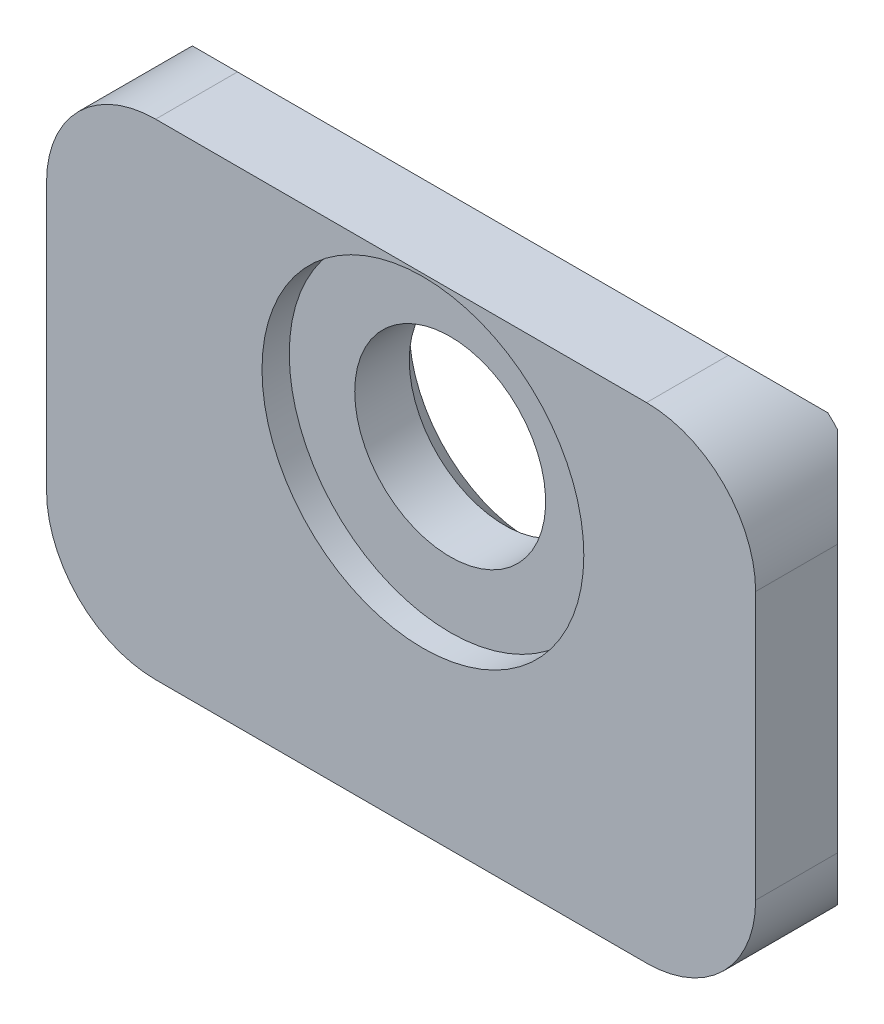
ISO-10303-21;
HEADER;
FILE_DESCRIPTION(('STEP AP214'),'2;1');
FILE_NAME('part.step','',(''),(''),'','','');
FILE_SCHEMA(('AUTOMOTIVE_DESIGN { 1 0 10303 214 1 1 1 1 }'));
ENDSEC;
DATA;
#1=APPLICATION_CONTEXT('core data for automotive mechanical design processes');
#2=APPLICATION_PROTOCOL_DEFINITION('international standard','automotive_design',2000,#1);
#3=PRODUCT_CONTEXT('',#1,'mechanical');
#4=PRODUCT('Part','Part','',(#3));
#5=PRODUCT_RELATED_PRODUCT_CATEGORY('part','',(#4));
#6=PRODUCT_DEFINITION_FORMATION('','',#4);
#7=PRODUCT_DEFINITION_CONTEXT('part definition',#1,'design');
#8=PRODUCT_DEFINITION('design','',#6,#7);
#9=PRODUCT_DEFINITION_SHAPE('','',#8);
#10=(LENGTH_UNIT() NAMED_UNIT(*) SI_UNIT(.MILLI.,.METRE.));
#11=(NAMED_UNIT(*) PLANE_ANGLE_UNIT() SI_UNIT($,.RADIAN.));
#12=(NAMED_UNIT(*) SI_UNIT($,.STERADIAN.) SOLID_ANGLE_UNIT());
#13=UNCERTAINTY_MEASURE_WITH_UNIT(LENGTH_MEASURE(1.E-05),#10,'distance_accuracy_value','');
#14=(GEOMETRIC_REPRESENTATION_CONTEXT(3) GLOBAL_UNCERTAINTY_ASSIGNED_CONTEXT((#13)) GLOBAL_UNIT_ASSIGNED_CONTEXT((#10,
#11,#12)) REPRESENTATION_CONTEXT('',''));
#15=CARTESIAN_POINT('',(0.,0.,0.));
#16=DIRECTION('',(0.,0.,1.));
#17=DIRECTION('',(1.,0.,0.));
#18=AXIS2_PLACEMENT_3D('',#15,#16,#17);
#19=CARTESIAN_POINT('',(13.4,1.45,0.));
#20=DIRECTION('',(0.,0.,1.));
#21=DIRECTION('',(-1.,0.,0.));
#22=AXIS2_PLACEMENT_3D('',#19,#20,#21);
#23=CYLINDRICAL_SURFACE('',#22,1.75);
#24=CARTESIAN_POINT('',(13.4,1.45,0.500000000000005));
#25=DIRECTION('',(0.,0.,1.));
#26=DIRECTION('',(1.,0.,0.));
#27=AXIS2_PLACEMENT_3D('',#24,#25,#26);
#28=CIRCLE('',#27,1.75);
#29=CARTESIAN_POINT('',(15.15,1.45,0.500000000000005));
#30=VERTEX_POINT('',#29);
#31=EDGE_CURVE('E177',#30,#30,#28,.T.);
#32=ORIENTED_EDGE('',*,*,#31,.F.);
#33=EDGE_LOOP('',(#32));
#34=FACE_BOUND('',#33,.T.);
#35=CARTESIAN_POINT('',(13.4,1.45,1.5));
#36=DIRECTION('',(0.,0.,-1.));
#37=DIRECTION('',(-1.,0.,0.));
#38=AXIS2_PLACEMENT_3D('',#35,#36,#37);
#39=CIRCLE('',#38,1.75);
#40=CARTESIAN_POINT('',(11.65,1.45,1.5));
#41=VERTEX_POINT('',#40);
#42=EDGE_CURVE('E274',#41,#41,#39,.F.);
#43=ORIENTED_EDGE('',*,*,#42,.T.);
#44=EDGE_LOOP('',(#43));
#45=FACE_BOUND('',#44,.T.);
#46=ADVANCED_FACE('F43',(#34,#45),#23,.F.);
#47=CARTESIAN_POINT('',(6.5,-4.45,2.));
#48=DIRECTION('',(1.,0.,0.));
#49=DIRECTION('',(0.,0.,1.));
#50=AXIS2_PLACEMENT_3D('',#47,#48,#49);
#51=PLANE('',#50);
#52=DIRECTION('',(0.,1.,0.));
#53=VECTOR('',#52,1.);
#54=CARTESIAN_POINT('',(6.5,4.45,0.500000000000002));
#55=LINE('',#54,#53);
#56=CARTESIAN_POINT('',(6.5,-2.45,0.500000000000002));
#57=VERTEX_POINT('',#56);
#58=CARTESIAN_POINT('',(6.5,2.45,0.500000000000002));
#59=VERTEX_POINT('',#58);
#60=EDGE_CURVE('E168',#57,#59,#55,.T.);
#61=ORIENTED_EDGE('',*,*,#60,.F.);
#62=DIRECTION('',(0.,0.,-1.));
#63=VECTOR('',#62,1.);
#64=CARTESIAN_POINT('',(6.5,-2.45,2.));
#65=LINE('',#64,#63);
#66=CARTESIAN_POINT('',(6.5,-2.45,2.));
#67=VERTEX_POINT('',#66);
#68=EDGE_CURVE('E228',#67,#57,#65,.T.);
#69=ORIENTED_EDGE('',*,*,#68,.F.);
#70=DIRECTION('',(0.,1.,0.));
#71=VECTOR('',#70,1.);
#72=CARTESIAN_POINT('',(6.5,-4.45,2.));
#73=LINE('',#72,#71);
#74=CARTESIAN_POINT('',(6.5,2.45,2.));
#75=VERTEX_POINT('',#74);
#76=EDGE_CURVE('E278',#67,#75,#73,.T.);
#77=ORIENTED_EDGE('',*,*,#76,.T.);
#78=DIRECTION('',(0.,0.,-1.));
#79=VECTOR('',#78,1.);
#80=CARTESIAN_POINT('',(6.5,2.45,2.));
#81=LINE('',#80,#79);
#82=EDGE_CURVE('E232',#59,#75,#81,.F.);
#83=ORIENTED_EDGE('',*,*,#82,.F.);
#84=EDGE_LOOP('',(#61,#69,#77,#83));
#85=FACE_BOUND('',#84,.T.);
#86=ADVANCED_FACE('F310',(#85),#51,.F.);
#87=CARTESIAN_POINT('',(19.5,4.45,2.));
#88=DIRECTION('',(0.,-1.,0.));
#89=DIRECTION('',(0.,0.,-1.));
#90=AXIS2_PLACEMENT_3D('',#87,#88,#89);
#91=PLANE('',#90);
#92=DIRECTION('',(1.,0.,0.));
#93=VECTOR('',#92,1.);
#94=CARTESIAN_POINT('',(19.5,4.45,0.500000000000002));
#95=LINE('',#94,#93);
#96=CARTESIAN_POINT('',(8.5,4.45,0.500000000000002));
#97=VERTEX_POINT('',#96);
#98=CARTESIAN_POINT('',(17.5,4.45,0.500000000000002));
#99=VERTEX_POINT('',#98);
#100=EDGE_CURVE('E269',#97,#99,#95,.T.);
#101=ORIENTED_EDGE('',*,*,#100,.F.);
#102=DIRECTION('',(0.,0.,-1.));
#103=VECTOR('',#102,1.);
#104=CARTESIAN_POINT('',(8.5,4.45,2.));
#105=LINE('',#104,#103);
#106=CARTESIAN_POINT('',(8.5,4.45,2.));
#107=VERTEX_POINT('',#106);
#108=EDGE_CURVE('E204',#107,#97,#105,.T.);
#109=ORIENTED_EDGE('',*,*,#108,.F.);
#110=DIRECTION('',(1.,0.,0.));
#111=VECTOR('',#110,1.);
#112=CARTESIAN_POINT('',(19.5,4.45,2.));
#113=LINE('',#112,#111);
#114=CARTESIAN_POINT('',(17.5,4.45,2.));
#115=VERTEX_POINT('',#114);
#116=EDGE_CURVE('E285',#107,#115,#113,.T.);
#117=ORIENTED_EDGE('',*,*,#116,.T.);
#118=DIRECTION('',(0.,0.,-1.));
#119=VECTOR('',#118,1.);
#120=CARTESIAN_POINT('',(17.5,4.45,2.));
#121=LINE('',#120,#119);
#122=EDGE_CURVE('E208',#99,#115,#121,.F.);
#123=ORIENTED_EDGE('',*,*,#122,.F.);
#124=EDGE_LOOP('',(#101,#109,#117,#123));
#125=FACE_BOUND('',#124,.T.);
#126=ADVANCED_FACE('F316',(#125),#91,.F.);
#127=CARTESIAN_POINT('',(19.5,-4.45,2.));
#128=DIRECTION('',(-1.,0.,0.));
#129=DIRECTION('',(0.,0.,-1.));
#130=AXIS2_PLACEMENT_3D('',#127,#128,#129);
#131=PLANE('',#130);
#132=DIRECTION('',(0.,-1.,0.));
#133=VECTOR('',#132,1.);
#134=CARTESIAN_POINT('',(19.5,-4.45,2.));
#135=LINE('',#134,#133);
#136=CARTESIAN_POINT('',(19.5,2.45,2.));
#137=VERTEX_POINT('',#136);
#138=CARTESIAN_POINT('',(19.5,-2.45,2.));
#139=VERTEX_POINT('',#138);
#140=EDGE_CURVE('E282',#137,#139,#135,.T.);
#141=ORIENTED_EDGE('',*,*,#140,.T.);
#142=DIRECTION('',(0.,0.,-1.));
#143=VECTOR('',#142,1.);
#144=CARTESIAN_POINT('',(19.5,-2.45,2.));
#145=LINE('',#144,#143);
#146=CARTESIAN_POINT('',(19.5,-2.45,0.500000000000002));
#147=VERTEX_POINT('',#146);
#148=EDGE_CURVE('E158',#147,#139,#145,.F.);
#149=ORIENTED_EDGE('',*,*,#148,.F.);
#150=DIRECTION('',(0.,-1.,0.));
#151=VECTOR('',#150,1.);
#152=CARTESIAN_POINT('',(19.5,-4.45,0.500000000000002));
#153=LINE('',#152,#151);
#154=CARTESIAN_POINT('',(19.5,2.45,0.500000000000002));
#155=VERTEX_POINT('',#154);
#156=EDGE_CURVE('E138',#155,#147,#153,.T.);
#157=ORIENTED_EDGE('',*,*,#156,.F.);
#158=DIRECTION('',(0.,0.,-1.));
#159=VECTOR('',#158,1.);
#160=CARTESIAN_POINT('',(19.5,2.45,2.));
#161=LINE('',#160,#159);
#162=EDGE_CURVE('E150',#137,#155,#161,.T.);
#163=ORIENTED_EDGE('',*,*,#162,.F.);
#164=EDGE_LOOP('',(#141,#149,#157,#163));
#165=FACE_BOUND('',#164,.T.);
#166=ADVANCED_FACE('F160',(#165),#131,.F.);
#167=CARTESIAN_POINT('',(19.5,-4.45,2.));
#168=DIRECTION('',(0.,1.,0.));
#169=DIRECTION('',(0.,0.,1.));
#170=AXIS2_PLACEMENT_3D('',#167,#168,#169);
#171=PLANE('',#170);
#172=DIRECTION('',(-1.,0.,0.));
#173=VECTOR('',#172,1.);
#174=CARTESIAN_POINT('',(6.5,-4.45,0.500000000000002));
#175=LINE('',#174,#173);
#176=CARTESIAN_POINT('',(17.5,-4.45,0.500000000000002));
#177=VERTEX_POINT('',#176);
#178=CARTESIAN_POINT('',(8.5,-4.45,0.500000000000002));
#179=VERTEX_POINT('',#178);
#180=EDGE_CURVE('E163',#177,#179,#175,.T.);
#181=ORIENTED_EDGE('',*,*,#180,.F.);
#182=DIRECTION('',(0.,0.,-1.));
#183=VECTOR('',#182,1.);
#184=CARTESIAN_POINT('',(17.5,-4.45,2.));
#185=LINE('',#184,#183);
#186=CARTESIAN_POINT('',(17.5,-4.45,2.));
#187=VERTEX_POINT('',#186);
#188=EDGE_CURVE('E52',#187,#177,#185,.T.);
#189=ORIENTED_EDGE('',*,*,#188,.F.);
#190=DIRECTION('',(-1.,0.,0.));
#191=VECTOR('',#190,1.);
#192=CARTESIAN_POINT('',(19.5,-4.45,2.));
#193=LINE('',#192,#191);
#194=CARTESIAN_POINT('',(8.5,-4.45,2.));
#195=VERTEX_POINT('',#194);
#196=EDGE_CURVE('E273',#187,#195,#193,.T.);
#197=ORIENTED_EDGE('',*,*,#196,.T.);
#198=DIRECTION('',(0.,0.,-1.));
#199=VECTOR('',#198,1.);
#200=CARTESIAN_POINT('',(8.5,-4.45,2.));
#201=LINE('',#200,#199);
#202=EDGE_CURVE('E11',#179,#195,#201,.F.);
#203=ORIENTED_EDGE('',*,*,#202,.F.);
#204=EDGE_LOOP('',(#181,#189,#197,#203));
#205=FACE_BOUND('',#204,.T.);
#206=ADVANCED_FACE('F246',(#205),#171,.F.);
#207=CARTESIAN_POINT('',(13.,0.,2.));
#208=DIRECTION('',(0.,0.,-1.));
#209=DIRECTION('',(1.,0.,0.));
#210=AXIS2_PLACEMENT_3D('',#207,#208,#209);
#211=PLANE('',#210);
#212=CARTESIAN_POINT('',(13.4,1.45,2.));
#213=DIRECTION('',(0.,0.,-1.));
#214=DIRECTION('',(-1.,0.,0.));
#215=AXIS2_PLACEMENT_3D('',#212,#213,#214);
#216=CIRCLE('',#215,2.95);
#217=CARTESIAN_POINT('',(10.45,1.45,2.));
#218=VERTEX_POINT('',#217);
#219=EDGE_CURVE('E292',#218,#218,#216,.T.);
#220=ORIENTED_EDGE('',*,*,#219,.T.);
#221=EDGE_LOOP('',(#220));
#222=FACE_BOUND('',#221,.T.);
#223=ORIENTED_EDGE('',*,*,#116,.F.);
#224=CARTESIAN_POINT('',(8.5,2.45,2.));
#225=DIRECTION('',(0.,0.,1.));
#226=DIRECTION('',(1.,0.,0.));
#227=AXIS2_PLACEMENT_3D('',#224,#225,#226);
#228=CIRCLE('',#227,2.);
#229=EDGE_CURVE('E217',#75,#107,#228,.F.);
#230=ORIENTED_EDGE('',*,*,#229,.F.);
#231=ORIENTED_EDGE('',*,*,#76,.F.);
#232=CARTESIAN_POINT('',(8.5,-2.45,2.));
#233=DIRECTION('',(0.,0.,1.));
#234=DIRECTION('',(1.,0.,0.));
#235=AXIS2_PLACEMENT_3D('',#232,#233,#234);
#236=CIRCLE('',#235,2.);
#237=EDGE_CURVE('E214',#195,#67,#236,.F.);
#238=ORIENTED_EDGE('',*,*,#237,.F.);
#239=ORIENTED_EDGE('',*,*,#196,.F.);
#240=CARTESIAN_POINT('',(17.5,-2.45,2.));
#241=DIRECTION('',(0.,0.,1.));
#242=DIRECTION('',(1.,0.,0.));
#243=AXIS2_PLACEMENT_3D('',#240,#241,#242);
#244=CIRCLE('',#243,2.);
#245=EDGE_CURVE('E211',#139,#187,#244,.F.);
#246=ORIENTED_EDGE('',*,*,#245,.F.);
#247=ORIENTED_EDGE('',*,*,#140,.F.);
#248=CARTESIAN_POINT('',(17.5,2.45,2.));
#249=DIRECTION('',(0.,0.,1.));
#250=DIRECTION('',(1.,0.,0.));
#251=AXIS2_PLACEMENT_3D('',#248,#249,#250);
#252=CIRCLE('',#251,2.);
#253=EDGE_CURVE('E153',#115,#137,#252,.F.);
#254=ORIENTED_EDGE('',*,*,#253,.F.);
#255=EDGE_LOOP('',(#223,#230,#231,#238,#239,#246,#247,#254));
#256=FACE_BOUND('',#255,.T.);
#257=ADVANCED_FACE('F322',(#222,#256),#211,.F.);
#258=CARTESIAN_POINT('',(13.,0.,0.));
#259=DIRECTION('',(0.,0.,-1.));
#260=DIRECTION('',(1.,0.,0.));
#261=AXIS2_PLACEMENT_3D('',#258,#259,#260);
#262=PLANE('',#261);
#263=DIRECTION('',(0.,1.,0.));
#264=VECTOR('',#263,1.);
#265=CARTESIAN_POINT('',(19.,4.45,0.));
#266=LINE('',#265,#264);
#267=CARTESIAN_POINT('',(19.,-3.7728756555323,0.));
#268=VERTEX_POINT('',#267);
#269=CARTESIAN_POINT('',(19.,3.7728756555323,0.));
#270=VERTEX_POINT('',#269);
#271=EDGE_CURVE('E141',#268,#270,#266,.T.);
#272=ORIENTED_EDGE('',*,*,#271,.F.);
#273=CARTESIAN_POINT('',(17.5,-2.45,0.));
#274=DIRECTION('',(0.,0.,1.));
#275=DIRECTION('',(1.,0.,0.));
#276=AXIS2_PLACEMENT_3D('',#273,#274,#275);
#277=CIRCLE('',#276,2.);
#278=CARTESIAN_POINT('',(18.8228756555323,-3.95,0.));
#279=VERTEX_POINT('',#278);
#280=EDGE_CURVE('E146',#279,#268,#277,.T.);
#281=ORIENTED_EDGE('',*,*,#280,.F.);
#282=DIRECTION('',(1.,0.,0.));
#283=VECTOR('',#282,1.);
#284=CARTESIAN_POINT('',(19.5,-3.95,0.));
#285=LINE('',#284,#283);
#286=CARTESIAN_POINT('',(7.1771243444677,-3.95,0.));
#287=VERTEX_POINT('',#286);
#288=EDGE_CURVE('E249',#287,#279,#285,.T.);
#289=ORIENTED_EDGE('',*,*,#288,.F.);
#290=CARTESIAN_POINT('',(8.5,-2.45,0.));
#291=DIRECTION('',(0.,0.,1.));
#292=DIRECTION('',(1.,0.,0.));
#293=AXIS2_PLACEMENT_3D('',#290,#291,#292);
#294=CIRCLE('',#293,2.);
#295=CARTESIAN_POINT('',(7.,-3.7728756555323,0.));
#296=VERTEX_POINT('',#295);
#297=EDGE_CURVE('E188',#296,#287,#294,.T.);
#298=ORIENTED_EDGE('',*,*,#297,.F.);
#299=DIRECTION('',(0.,-1.,0.));
#300=VECTOR('',#299,1.);
#301=CARTESIAN_POINT('',(7.,-4.45,0.));
#302=LINE('',#301,#300);
#303=CARTESIAN_POINT('',(7.,3.7728756555323,0.));
#304=VERTEX_POINT('',#303);
#305=EDGE_CURVE('E259',#304,#296,#302,.T.);
#306=ORIENTED_EDGE('',*,*,#305,.F.);
#307=CARTESIAN_POINT('',(8.5,2.45,0.));
#308=DIRECTION('',(0.,0.,1.));
#309=DIRECTION('',(1.,0.,0.));
#310=AXIS2_PLACEMENT_3D('',#307,#308,#309);
#311=CIRCLE('',#310,2.);
#312=CARTESIAN_POINT('',(7.1771243444677,3.95,0.));
#313=VERTEX_POINT('',#312);
#314=EDGE_CURVE('E191',#313,#304,#311,.T.);
#315=ORIENTED_EDGE('',*,*,#314,.F.);
#316=DIRECTION('',(-1.,0.,0.));
#317=VECTOR('',#316,1.);
#318=CARTESIAN_POINT('',(6.5,3.95,0.));
#319=LINE('',#318,#317);
#320=CARTESIAN_POINT('',(18.8228756555323,3.95,0.));
#321=VERTEX_POINT('',#320);
#322=EDGE_CURVE('E164',#321,#313,#319,.T.);
#323=ORIENTED_EDGE('',*,*,#322,.F.);
#324=CARTESIAN_POINT('',(17.5,2.45,0.));
#325=DIRECTION('',(0.,0.,1.));
#326=DIRECTION('',(1.,0.,0.));
#327=AXIS2_PLACEMENT_3D('',#324,#325,#326);
#328=CIRCLE('',#327,2.);
#329=EDGE_CURVE('E195',#270,#321,#328,.T.);
#330=ORIENTED_EDGE('',*,*,#329,.F.);
#331=EDGE_LOOP('',(#272,#281,#289,#298,#306,#315,#323,#330));
#332=FACE_BOUND('',#331,.T.);
#333=CARTESIAN_POINT('',(13.4,1.45,0.));
#334=DIRECTION('',(0.,0.,1.));
#335=DIRECTION('',(1.,0.,0.));
#336=AXIS2_PLACEMENT_3D('',#333,#334,#335);
#337=CIRCLE('',#336,2.25);
#338=CARTESIAN_POINT('',(15.65,1.45,0.));
#339=VERTEX_POINT('',#338);
#340=EDGE_CURVE('E263',#339,#339,#337,.F.);
#341=ORIENTED_EDGE('',*,*,#340,.F.);
#342=EDGE_LOOP('',(#341));
#343=FACE_BOUND('',#342,.T.);
#344=ADVANCED_FACE('F256',(#332,#343),#262,.T.);
#345=CARTESIAN_POINT('',(13.4,1.45,1.5));
#346=DIRECTION('',(0.,0.,1.));
#347=DIRECTION('',(-1.,0.,0.));
#348=AXIS2_PLACEMENT_3D('',#345,#346,#347);
#349=PLANE('',#348);
#350=CARTESIAN_POINT('',(13.4,1.45,1.5));
#351=DIRECTION('',(0.,0.,-1.));
#352=DIRECTION('',(-1.,0.,0.));
#353=AXIS2_PLACEMENT_3D('',#350,#351,#352);
#354=CIRCLE('',#353,2.95);
#355=CARTESIAN_POINT('',(10.45,1.45,1.5));
#356=VERTEX_POINT('',#355);
#357=EDGE_CURVE('E279',#356,#356,#354,.T.);
#358=ORIENTED_EDGE('',*,*,#357,.F.);
#359=EDGE_LOOP('',(#358));
#360=FACE_BOUND('',#359,.T.);
#361=ORIENTED_EDGE('',*,*,#42,.F.);
#362=EDGE_LOOP('',(#361));
#363=FACE_BOUND('',#362,.T.);
#364=ADVANCED_FACE('F303',(#360,#363),#349,.T.);
#365=CARTESIAN_POINT('',(13.4,1.45,1.5));
#366=DIRECTION('',(0.,0.,1.));
#367=DIRECTION('',(-1.,0.,0.));
#368=AXIS2_PLACEMENT_3D('',#365,#366,#367);
#369=CYLINDRICAL_SURFACE('',#368,2.95);
#370=ORIENTED_EDGE('',*,*,#357,.T.);
#371=EDGE_LOOP('',(#370));
#372=FACE_BOUND('',#371,.T.);
#373=ORIENTED_EDGE('',*,*,#219,.F.);
#374=EDGE_LOOP('',(#373));
#375=FACE_BOUND('',#374,.T.);
#376=ADVANCED_FACE('F300',(#372,#375),#369,.F.);
#377=CARTESIAN_POINT('',(19.5,-4.45,0.500000000000002));
#378=DIRECTION('',(0.,-0.707106781186546,-0.707106781186549));
#379=DIRECTION('',(1.,0.,0.));
#380=AXIS2_PLACEMENT_3D('',#377,#378,#379);
#381=PLANE('',#380);
#382=ORIENTED_EDGE('',*,*,#288,.T.);
#383=CARTESIAN_POINT('',(17.5,-2.45,-1.49999999999999));
#384=DIRECTION('',(0.,0.707106781186546,0.707106781186549));
#385=DIRECTION('',(0.,0.707106781186549,-0.707106781186546));
#386=AXIS2_PLACEMENT_3D('',#383,#384,#385);
#387=ELLIPSE('',#386,2.82842712474618,2.);
#388=EDGE_CURVE('E66',#177,#279,#387,.T.);
#389=ORIENTED_EDGE('',*,*,#388,.F.);
#390=ORIENTED_EDGE('',*,*,#180,.T.);
#391=CARTESIAN_POINT('',(8.5,-2.45,-1.49999999999999));
#392=DIRECTION('',(0.,0.707106781186546,0.707106781186549));
#393=DIRECTION('',(0.,0.707106781186549,-0.707106781186546));
#394=AXIS2_PLACEMENT_3D('',#391,#392,#393);
#395=ELLIPSE('',#394,2.82842712474618,2.);
#396=EDGE_CURVE('E58',#287,#179,#395,.T.);
#397=ORIENTED_EDGE('',*,*,#396,.F.);
#398=EDGE_LOOP('',(#382,#389,#390,#397));
#399=FACE_BOUND('',#398,.T.);
#400=ADVANCED_FACE('F247',(#399),#381,.T.);
#401=CARTESIAN_POINT('',(6.5,-4.45,0.500000000000002));
#402=DIRECTION('',(-0.707106781186546,0.,-0.707106781186549));
#403=DIRECTION('',(0.,-1.,0.));
#404=AXIS2_PLACEMENT_3D('',#401,#402,#403);
#405=PLANE('',#404);
#406=ORIENTED_EDGE('',*,*,#305,.T.);
#407=CARTESIAN_POINT('',(8.5,-2.45,-1.49999999999999));
#408=DIRECTION('',(0.707106781186546,0.,0.707106781186549));
#409=DIRECTION('',(0.707106781186549,0.,-0.707106781186546));
#410=AXIS2_PLACEMENT_3D('',#407,#408,#409);
#411=ELLIPSE('',#410,2.82842712474618,2.);
#412=EDGE_CURVE('E222',#57,#296,#411,.T.);
#413=ORIENTED_EDGE('',*,*,#412,.F.);
#414=ORIENTED_EDGE('',*,*,#60,.T.);
#415=CARTESIAN_POINT('',(8.5,2.45,-1.49999999999999));
#416=DIRECTION('',(0.707106781186546,0.,0.707106781186549));
#417=DIRECTION('',(0.707106781186549,0.,-0.707106781186546));
#418=AXIS2_PLACEMENT_3D('',#415,#416,#417);
#419=ELLIPSE('',#418,2.82842712474618,2.);
#420=EDGE_CURVE('E225',#304,#59,#419,.T.);
#421=ORIENTED_EDGE('',*,*,#420,.F.);
#422=EDGE_LOOP('',(#406,#413,#414,#421));
#423=FACE_BOUND('',#422,.T.);
#424=ADVANCED_FACE('F342',(#423),#405,.T.);
#425=CARTESIAN_POINT('',(19.5,-4.45,0.500000000000002));
#426=DIRECTION('',(0.707106781186546,0.,-0.707106781186549));
#427=DIRECTION('',(0.,1.,0.));
#428=AXIS2_PLACEMENT_3D('',#425,#426,#427);
#429=PLANE('',#428);
#430=ORIENTED_EDGE('',*,*,#156,.T.);
#431=CARTESIAN_POINT('',(17.5,-2.45,-1.49999999999999));
#432=DIRECTION('',(-0.707106781186546,0.,0.707106781186549));
#433=DIRECTION('',(-0.707106781186549,0.,-0.707106781186546));
#434=AXIS2_PLACEMENT_3D('',#431,#432,#433);
#435=ELLIPSE('',#434,2.82842712474618,2.);
#436=EDGE_CURVE('E147',#268,#147,#435,.T.);
#437=ORIENTED_EDGE('',*,*,#436,.F.);
#438=ORIENTED_EDGE('',*,*,#271,.T.);
#439=CARTESIAN_POINT('',(17.5,2.45,-1.49999999999999));
#440=DIRECTION('',(-0.707106781186546,0.,0.707106781186549));
#441=DIRECTION('',(-0.707106781186549,0.,-0.707106781186546));
#442=AXIS2_PLACEMENT_3D('',#439,#440,#441);
#443=ELLIPSE('',#442,2.82842712474618,2.);
#444=EDGE_CURVE('E134',#155,#270,#443,.T.);
#445=ORIENTED_EDGE('',*,*,#444,.F.);
#446=EDGE_LOOP('',(#430,#437,#438,#445));
#447=FACE_BOUND('',#446,.T.);
#448=ADVANCED_FACE('F136',(#447),#429,.T.);
#449=CARTESIAN_POINT('',(19.5,4.45,0.500000000000002));
#450=DIRECTION('',(0.,0.707106781186546,-0.707106781186549));
#451=DIRECTION('',(-1.,0.,0.));
#452=AXIS2_PLACEMENT_3D('',#449,#450,#451);
#453=PLANE('',#452);
#454=ORIENTED_EDGE('',*,*,#322,.T.);
#455=CARTESIAN_POINT('',(8.5,2.45,-1.49999999999999));
#456=DIRECTION('',(0.,-0.707106781186546,0.707106781186549));
#457=DIRECTION('',(0.,-0.707106781186549,-0.707106781186546));
#458=AXIS2_PLACEMENT_3D('',#455,#456,#457);
#459=ELLIPSE('',#458,2.82842712474618,2.);
#460=EDGE_CURVE('E198',#97,#313,#459,.T.);
#461=ORIENTED_EDGE('',*,*,#460,.F.);
#462=ORIENTED_EDGE('',*,*,#100,.T.);
#463=CARTESIAN_POINT('',(17.5,2.45,-1.49999999999999));
#464=DIRECTION('',(0.,-0.707106781186546,0.707106781186549));
#465=DIRECTION('',(0.,-0.707106781186549,-0.707106781186546));
#466=AXIS2_PLACEMENT_3D('',#463,#464,#465);
#467=ELLIPSE('',#466,2.82842712474618,2.);
#468=EDGE_CURVE('E201',#321,#99,#467,.T.);
#469=ORIENTED_EDGE('',*,*,#468,.F.);
#470=EDGE_LOOP('',(#454,#461,#462,#469));
#471=FACE_BOUND('',#470,.T.);
#472=ADVANCED_FACE('F335',(#471),#453,.T.);
#473=CARTESIAN_POINT('',(13.4,1.45,0.));
#474=DIRECTION('',(0.,0.,-1.));
#475=DIRECTION('',(1.,0.,0.));
#476=AXIS2_PLACEMENT_3D('',#473,#474,#475);
#477=CONICAL_SURFACE('',#476,2.25,0.785398163397447);
#478=ORIENTED_EDGE('',*,*,#31,.T.);
#479=EDGE_LOOP('',(#478));
#480=FACE_BOUND('',#479,.T.);
#481=ORIENTED_EDGE('',*,*,#340,.T.);
#482=EDGE_LOOP('',(#481));
#483=FACE_BOUND('',#482,.T.);
#484=ADVANCED_FACE('F338',(#480,#483),#477,.F.);
#485=CARTESIAN_POINT('',(17.5,2.45,2.));
#486=DIRECTION('',(0.,0.,-1.));
#487=DIRECTION('',(1.,0.,0.));
#488=AXIS2_PLACEMENT_3D('',#485,#486,#487);
#489=CYLINDRICAL_SURFACE('',#488,2.);
#490=ORIENTED_EDGE('',*,*,#253,.T.);
#491=ORIENTED_EDGE('',*,*,#162,.T.);
#492=ORIENTED_EDGE('',*,*,#444,.T.);
#493=ORIENTED_EDGE('',*,*,#329,.T.);
#494=ORIENTED_EDGE('',*,*,#468,.T.);
#495=ORIENTED_EDGE('',*,*,#122,.T.);
#496=EDGE_LOOP('',(#490,#491,#492,#493,#494,#495));
#497=FACE_BOUND('',#496,.T.);
#498=ADVANCED_FACE('F151',(#497),#489,.T.);
#499=CARTESIAN_POINT('',(8.5,2.45,2.));
#500=DIRECTION('',(0.,0.,-1.));
#501=DIRECTION('',(1.,0.,0.));
#502=AXIS2_PLACEMENT_3D('',#499,#500,#501);
#503=CYLINDRICAL_SURFACE('',#502,2.);
#504=ORIENTED_EDGE('',*,*,#229,.T.);
#505=ORIENTED_EDGE('',*,*,#108,.T.);
#506=ORIENTED_EDGE('',*,*,#460,.T.);
#507=ORIENTED_EDGE('',*,*,#314,.T.);
#508=ORIENTED_EDGE('',*,*,#420,.T.);
#509=ORIENTED_EDGE('',*,*,#82,.T.);
#510=EDGE_LOOP('',(#504,#505,#506,#507,#508,#509));
#511=FACE_BOUND('',#510,.T.);
#512=ADVANCED_FACE('F353',(#511),#503,.T.);
#513=CARTESIAN_POINT('',(8.5,-2.45,2.));
#514=DIRECTION('',(0.,0.,-1.));
#515=DIRECTION('',(1.,0.,0.));
#516=AXIS2_PLACEMENT_3D('',#513,#514,#515);
#517=CYLINDRICAL_SURFACE('',#516,2.);
#518=ORIENTED_EDGE('',*,*,#237,.T.);
#519=ORIENTED_EDGE('',*,*,#68,.T.);
#520=ORIENTED_EDGE('',*,*,#412,.T.);
#521=ORIENTED_EDGE('',*,*,#297,.T.);
#522=ORIENTED_EDGE('',*,*,#396,.T.);
#523=ORIENTED_EDGE('',*,*,#202,.T.);
#524=EDGE_LOOP('',(#518,#519,#520,#521,#522,#523));
#525=FACE_BOUND('',#524,.T.);
#526=ADVANCED_FACE('F252',(#525),#517,.T.);
#527=CARTESIAN_POINT('',(17.5,-2.45,2.));
#528=DIRECTION('',(0.,0.,-1.));
#529=DIRECTION('',(1.,0.,0.));
#530=AXIS2_PLACEMENT_3D('',#527,#528,#529);
#531=CYLINDRICAL_SURFACE('',#530,2.);
#532=ORIENTED_EDGE('',*,*,#245,.T.);
#533=ORIENTED_EDGE('',*,*,#188,.T.);
#534=ORIENTED_EDGE('',*,*,#388,.T.);
#535=ORIENTED_EDGE('',*,*,#280,.T.);
#536=ORIENTED_EDGE('',*,*,#436,.T.);
#537=ORIENTED_EDGE('',*,*,#148,.T.);
#538=EDGE_LOOP('',(#532,#533,#534,#535,#536,#537));
#539=FACE_BOUND('',#538,.T.);
#540=ADVANCED_FACE('F45',(#539),#531,.T.);
#541=CLOSED_SHELL('',(#46,#86,#126,#166,#206,#257,#344,#364,#376,#400,#424,#448,#472,#484,#498,
#512,#526,#540));
#542=MANIFOLD_SOLID_BREP('B2',#541);
#543=ADVANCED_BREP_SHAPE_REPRESENTATION('',(#18,#542),#14);
#544=SHAPE_DEFINITION_REPRESENTATION(#9,#543);
ENDSEC;
END-ISO-10303-21;
